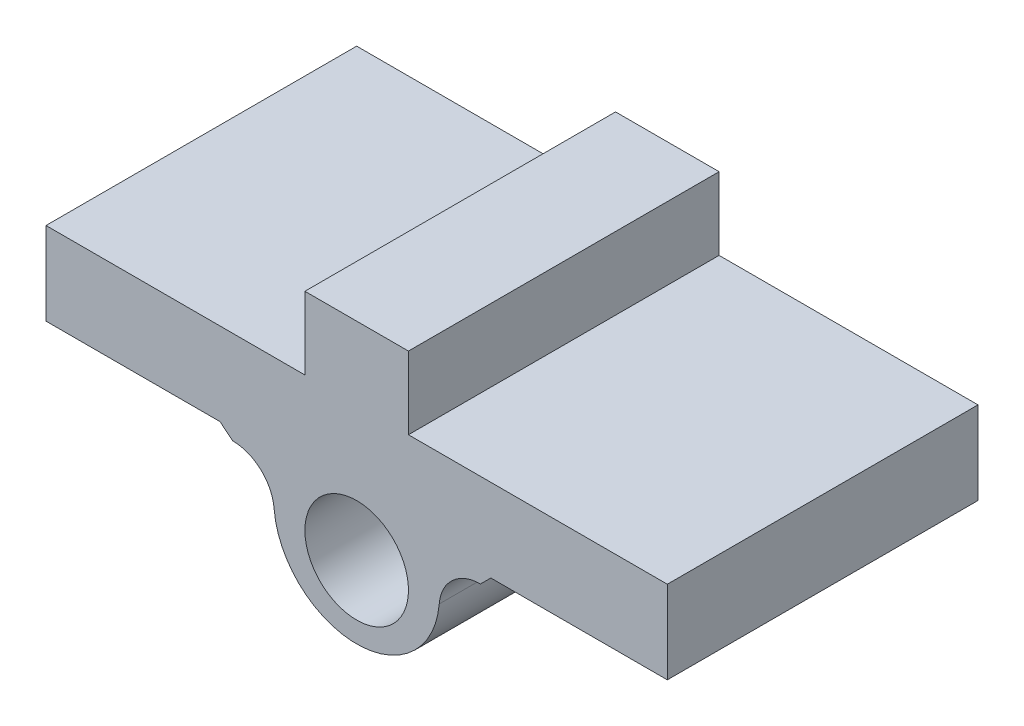
ISO-10303-21;
HEADER;
FILE_DESCRIPTION(('STEP AP214'),'2;1');
FILE_NAME('part.step','',(''),(''),'','','');
FILE_SCHEMA(('AUTOMOTIVE_DESIGN { 1 0 10303 214 1 1 1 1 }'));
ENDSEC;
DATA;
#1=APPLICATION_CONTEXT('core data for automotive mechanical design processes');
#2=APPLICATION_PROTOCOL_DEFINITION('international standard','automotive_design',2000,#1);
#3=PRODUCT_CONTEXT('',#1,'mechanical');
#4=PRODUCT('Part','Part','',(#3));
#5=PRODUCT_RELATED_PRODUCT_CATEGORY('part','',(#4));
#6=PRODUCT_DEFINITION_FORMATION('','',#4);
#7=PRODUCT_DEFINITION_CONTEXT('part definition',#1,'design');
#8=PRODUCT_DEFINITION('design','',#6,#7);
#9=PRODUCT_DEFINITION_SHAPE('','',#8);
#10=(LENGTH_UNIT() NAMED_UNIT(*) SI_UNIT(.MILLI.,.METRE.));
#11=(NAMED_UNIT(*) PLANE_ANGLE_UNIT() SI_UNIT($,.RADIAN.));
#12=(NAMED_UNIT(*) SI_UNIT($,.STERADIAN.) SOLID_ANGLE_UNIT());
#13=UNCERTAINTY_MEASURE_WITH_UNIT(LENGTH_MEASURE(1.E-05),#10,'distance_accuracy_value','');
#14=(GEOMETRIC_REPRESENTATION_CONTEXT(3) GLOBAL_UNCERTAINTY_ASSIGNED_CONTEXT((#13)) GLOBAL_UNIT_ASSIGNED_CONTEXT((#10,
#11,#12)) REPRESENTATION_CONTEXT('',''));
#15=CARTESIAN_POINT('',(0.,0.,0.));
#16=DIRECTION('',(0.,0.,1.));
#17=DIRECTION('',(1.,0.,0.));
#18=AXIS2_PLACEMENT_3D('',#15,#16,#17);
#19=CARTESIAN_POINT('',(0.,0.,0.));
#20=DIRECTION('',(0.,-1.,0.));
#21=DIRECTION('',(0.,0.,-1.));
#22=AXIS2_PLACEMENT_3D('',#19,#20,#21);
#23=PLANE('',#22);
#24=DIRECTION('',(0.,0.,-1.));
#25=VECTOR('',#24,1.);
#26=CARTESIAN_POINT('',(16.8030447960703,0.,28.7766454131789));
#27=LINE('',#26,#25);
#28=CARTESIAN_POINT('',(16.8030447960703,0.,0.));
#29=VERTEX_POINT('',#28);
#30=CARTESIAN_POINT('',(16.8030447960703,0.,-30.));
#31=VERTEX_POINT('',#30);
#32=EDGE_CURVE('E236',#29,#31,#27,.T.);
#33=ORIENTED_EDGE('',*,*,#32,.F.);
#34=DIRECTION('',(1.,0.,0.));
#35=VECTOR('',#34,1.);
#36=CARTESIAN_POINT('',(0.,0.,0.));
#37=LINE('',#36,#35);
#38=CARTESIAN_POINT('',(0.,0.,0.));
#39=VERTEX_POINT('',#38);
#40=EDGE_CURVE('E188',#39,#29,#37,.T.);
#41=ORIENTED_EDGE('',*,*,#40,.F.);
#42=DIRECTION('',(0.,0.,1.));
#43=VECTOR('',#42,1.);
#44=CARTESIAN_POINT('',(0.,0.,0.));
#45=LINE('',#44,#43);
#46=CARTESIAN_POINT('',(0.,0.,-30.));
#47=VERTEX_POINT('',#46);
#48=EDGE_CURVE('E190',#47,#39,#45,.T.);
#49=ORIENTED_EDGE('',*,*,#48,.F.);
#50=DIRECTION('',(-1.,0.,0.));
#51=VECTOR('',#50,1.);
#52=CARTESIAN_POINT('',(0.,0.,-30.));
#53=LINE('',#52,#51);
#54=EDGE_CURVE('E168',#31,#47,#53,.T.);
#55=ORIENTED_EDGE('',*,*,#54,.F.);
#56=EDGE_LOOP('',(#33,#41,#49,#55));
#57=FACE_BOUND('',#56,.T.);
#58=ADVANCED_FACE('F37',(#57),#23,.T.);
#59=CARTESIAN_POINT('',(0.,8.,0.));
#60=DIRECTION('',(0.,-1.,0.));
#61=DIRECTION('',(0.,0.,-1.));
#62=AXIS2_PLACEMENT_3D('',#59,#60,#61);
#63=PLANE('',#62);
#64=DIRECTION('',(0.,0.,1.));
#65=VECTOR('',#64,1.);
#66=CARTESIAN_POINT('',(25.,8.,-30.));
#67=LINE('',#66,#65);
#68=CARTESIAN_POINT('',(25.,8.,-30.));
#69=VERTEX_POINT('',#68);
#70=CARTESIAN_POINT('',(25.,8.,0.));
#71=VERTEX_POINT('',#70);
#72=EDGE_CURVE('E52',#69,#71,#67,.T.);
#73=ORIENTED_EDGE('',*,*,#72,.F.);
#74=DIRECTION('',(-1.,0.,0.));
#75=VECTOR('',#74,1.);
#76=CARTESIAN_POINT('',(0.,8.,-30.));
#77=LINE('',#76,#75);
#78=CARTESIAN_POINT('',(0.,8.,-30.));
#79=VERTEX_POINT('',#78);
#80=EDGE_CURVE('E196',#69,#79,#77,.T.);
#81=ORIENTED_EDGE('',*,*,#80,.T.);
#82=DIRECTION('',(0.,0.,1.));
#83=VECTOR('',#82,1.);
#84=CARTESIAN_POINT('',(0.,8.,0.));
#85=LINE('',#84,#83);
#86=CARTESIAN_POINT('',(0.,8.,0.));
#87=VERTEX_POINT('',#86);
#88=EDGE_CURVE('E167',#79,#87,#85,.T.);
#89=ORIENTED_EDGE('',*,*,#88,.T.);
#90=DIRECTION('',(1.,0.,0.));
#91=VECTOR('',#90,1.);
#92=CARTESIAN_POINT('',(0.,8.,0.));
#93=LINE('',#92,#91);
#94=EDGE_CURVE('E198',#87,#71,#93,.T.);
#95=ORIENTED_EDGE('',*,*,#94,.T.);
#96=EDGE_LOOP('',(#73,#81,#89,#95));
#97=FACE_BOUND('',#96,.T.);
#98=ADVANCED_FACE('F296',(#97),#63,.F.);
#99=DIRECTION('',(0.,0.,-1.));
#100=VECTOR('',#99,1.);
#101=CARTESIAN_POINT('',(35.,8.,-30.));
#102=LINE('',#101,#100);
#103=CARTESIAN_POINT('',(35.,8.,0.));
#104=VERTEX_POINT('',#103);
#105=CARTESIAN_POINT('',(35.,8.,-30.));
#106=VERTEX_POINT('',#105);
#107=EDGE_CURVE('E60',#104,#106,#102,.T.);
#108=ORIENTED_EDGE('',*,*,#107,.F.);
#109=CARTESIAN_POINT('',(60.,8.,0.));
#110=VERTEX_POINT('',#109);
#111=EDGE_CURVE('E171',#104,#110,#93,.T.);
#112=ORIENTED_EDGE('',*,*,#111,.T.);
#113=DIRECTION('',(0.,0.,-1.));
#114=VECTOR('',#113,1.);
#115=CARTESIAN_POINT('',(60.,8.,0.));
#116=LINE('',#115,#114);
#117=CARTESIAN_POINT('',(60.,8.,-30.));
#118=VERTEX_POINT('',#117);
#119=EDGE_CURVE('E186',#110,#118,#116,.T.);
#120=ORIENTED_EDGE('',*,*,#119,.T.);
#121=EDGE_CURVE('E180',#118,#106,#77,.T.);
#122=ORIENTED_EDGE('',*,*,#121,.T.);
#123=EDGE_LOOP('',(#108,#112,#120,#122));
#124=FACE_BOUND('',#123,.T.);
#125=ADVANCED_FACE('F294',(#124),#63,.F.);
#126=CARTESIAN_POINT('',(0.,8.,0.));
#127=DIRECTION('',(1.,0.,0.));
#128=DIRECTION('',(0.,0.,-1.));
#129=AXIS2_PLACEMENT_3D('',#126,#127,#128);
#130=PLANE('',#129);
#131=ORIENTED_EDGE('',*,*,#48,.T.);
#132=DIRECTION('',(0.,-1.,0.));
#133=VECTOR('',#132,1.);
#134=CARTESIAN_POINT('',(0.,8.,0.));
#135=LINE('',#134,#133);
#136=EDGE_CURVE('E11',#87,#39,#135,.T.);
#137=ORIENTED_EDGE('',*,*,#136,.F.);
#138=ORIENTED_EDGE('',*,*,#88,.F.);
#139=DIRECTION('',(0.,-1.,0.));
#140=VECTOR('',#139,1.);
#141=CARTESIAN_POINT('',(0.,8.,-30.));
#142=LINE('',#141,#140);
#143=EDGE_CURVE('E177',#79,#47,#142,.T.);
#144=ORIENTED_EDGE('',*,*,#143,.T.);
#145=EDGE_LOOP('',(#131,#137,#138,#144));
#146=FACE_BOUND('',#145,.T.);
#147=ADVANCED_FACE('F39',(#146),#130,.F.);
#148=CARTESIAN_POINT('',(0.,8.,0.));
#149=DIRECTION('',(0.,0.,-1.));
#150=DIRECTION('',(-1.,0.,0.));
#151=AXIS2_PLACEMENT_3D('',#148,#149,#150);
#152=PLANE('',#151);
#153=ORIENTED_EDGE('',*,*,#40,.T.);
#154=DIRECTION('',(0.778089765424907,-0.628153099921519,0.));
#155=VECTOR('',#154,1.);
#156=CARTESIAN_POINT('',(18.0417392568986,-1.,0.));
#157=LINE('',#156,#155);
#158=CARTESIAN_POINT('',(18.0417392568986,-1.,0.));
#159=VERTEX_POINT('',#158);
#160=EDGE_CURVE('E226',#29,#159,#157,.T.);
#161=ORIENTED_EDGE('',*,*,#160,.T.);
#162=CARTESIAN_POINT('',(18.0417392568986,-5.,0.));
#163=DIRECTION('',(0.,0.,-1.));
#164=DIRECTION('',(-1.,0.,0.));
#165=AXIS2_PLACEMENT_3D('',#162,#163,#164);
#166=CIRCLE('',#165,4.);
#167=CARTESIAN_POINT('',(22.0278261712657,-4.66666666666667,0.));
#168=VERTEX_POINT('',#167);
#169=EDGE_CURVE('E248',#159,#168,#166,.T.);
#170=ORIENTED_EDGE('',*,*,#169,.T.);
#171=CARTESIAN_POINT('',(30.,-4.,0.));
#172=DIRECTION('',(0.,0.,-1.));
#173=DIRECTION('',(-1.,0.,0.));
#174=AXIS2_PLACEMENT_3D('',#171,#172,#173);
#175=CIRCLE('',#174,8.);
#176=CARTESIAN_POINT('',(37.9721738287343,-4.66666666666666,0.));
#177=VERTEX_POINT('',#176);
#178=EDGE_CURVE('E250',#168,#177,#175,.F.);
#179=ORIENTED_EDGE('',*,*,#178,.T.);
#180=CARTESIAN_POINT('',(41.9582607431014,-5.,0.));
#181=DIRECTION('',(0.,0.,-1.));
#182=DIRECTION('',(-1.,0.,0.));
#183=AXIS2_PLACEMENT_3D('',#180,#181,#182);
#184=CIRCLE('',#183,4.);
#185=CARTESIAN_POINT('',(41.9582607431014,-1.,0.));
#186=VERTEX_POINT('',#185);
#187=EDGE_CURVE('E252',#177,#186,#184,.T.);
#188=ORIENTED_EDGE('',*,*,#187,.T.);
#189=DIRECTION('',(0.70710678118655,0.707106781186545,0.));
#190=VECTOR('',#189,1.);
#191=CARTESIAN_POINT('',(41.9582607431014,-1.,0.));
#192=LINE('',#191,#190);
#193=CARTESIAN_POINT('',(42.9582607431014,0.,0.));
#194=VERTEX_POINT('',#193);
#195=EDGE_CURVE('E238',#186,#194,#192,.T.);
#196=ORIENTED_EDGE('',*,*,#195,.T.);
#197=CARTESIAN_POINT('',(60.,0.,0.));
#198=VERTEX_POINT('',#197);
#199=EDGE_CURVE('E157',#194,#198,#37,.T.);
#200=ORIENTED_EDGE('',*,*,#199,.T.);
#201=DIRECTION('',(0.,-1.,0.));
#202=VECTOR('',#201,1.);
#203=CARTESIAN_POINT('',(60.,8.,0.));
#204=LINE('',#203,#202);
#205=EDGE_CURVE('E45',#110,#198,#204,.T.);
#206=ORIENTED_EDGE('',*,*,#205,.F.);
#207=ORIENTED_EDGE('',*,*,#111,.F.);
#208=DIRECTION('',(0.,-1.,0.));
#209=VECTOR('',#208,1.);
#210=CARTESIAN_POINT('',(35.,15.,0.));
#211=LINE('',#210,#209);
#212=CARTESIAN_POINT('',(35.,15.,0.));
#213=VERTEX_POINT('',#212);
#214=EDGE_CURVE('E202',#213,#104,#211,.T.);
#215=ORIENTED_EDGE('',*,*,#214,.F.);
#216=DIRECTION('',(1.,0.,0.));
#217=VECTOR('',#216,1.);
#218=CARTESIAN_POINT('',(25.,15.,0.));
#219=LINE('',#218,#217);
#220=CARTESIAN_POINT('',(25.,15.,0.));
#221=VERTEX_POINT('',#220);
#222=EDGE_CURVE('E219',#221,#213,#219,.T.);
#223=ORIENTED_EDGE('',*,*,#222,.F.);
#224=DIRECTION('',(0.,-1.,0.));
#225=VECTOR('',#224,1.);
#226=CARTESIAN_POINT('',(25.,15.,0.));
#227=LINE('',#226,#225);
#228=EDGE_CURVE('E194',#221,#71,#227,.T.);
#229=ORIENTED_EDGE('',*,*,#228,.T.);
#230=ORIENTED_EDGE('',*,*,#94,.F.);
#231=ORIENTED_EDGE('',*,*,#136,.T.);
#232=EDGE_LOOP('',(#153,#161,#170,#179,#188,#196,#200,#206,#207,#215,#223,#229,#230,#231));
#233=FACE_BOUND('',#232,.T.);
#234=CARTESIAN_POINT('',(30.,-5.,0.));
#235=DIRECTION('',(0.,0.,-1.));
#236=DIRECTION('',(-1.,0.,0.));
#237=AXIS2_PLACEMENT_3D('',#234,#235,#236);
#238=CIRCLE('',#237,5.);
#239=CARTESIAN_POINT('',(25.,-5.,0.));
#240=VERTEX_POINT('',#239);
#241=EDGE_CURVE('E215',#240,#240,#238,.T.);
#242=ORIENTED_EDGE('',*,*,#241,.T.);
#243=EDGE_LOOP('',(#242));
#244=FACE_BOUND('',#243,.T.);
#245=ADVANCED_FACE('F254',(#233,#244),#152,.F.);
#246=CARTESIAN_POINT('',(60.,8.,0.));
#247=DIRECTION('',(-1.,0.,0.));
#248=DIRECTION('',(0.,0.,1.));
#249=AXIS2_PLACEMENT_3D('',#246,#247,#248);
#250=PLANE('',#249);
#251=DIRECTION('',(0.,0.,-1.));
#252=VECTOR('',#251,1.);
#253=CARTESIAN_POINT('',(60.,0.,0.));
#254=LINE('',#253,#252);
#255=CARTESIAN_POINT('',(60.,0.,-30.));
#256=VERTEX_POINT('',#255);
#257=EDGE_CURVE('E173',#198,#256,#254,.T.);
#258=ORIENTED_EDGE('',*,*,#257,.T.);
#259=DIRECTION('',(0.,-1.,0.));
#260=VECTOR('',#259,1.);
#261=CARTESIAN_POINT('',(60.,8.,-30.));
#262=LINE('',#261,#260);
#263=EDGE_CURVE('E166',#118,#256,#262,.T.);
#264=ORIENTED_EDGE('',*,*,#263,.F.);
#265=ORIENTED_EDGE('',*,*,#119,.F.);
#266=ORIENTED_EDGE('',*,*,#205,.T.);
#267=EDGE_LOOP('',(#258,#264,#265,#266));
#268=FACE_BOUND('',#267,.T.);
#269=ADVANCED_FACE('F185',(#268),#250,.F.);
#270=CARTESIAN_POINT('',(0.,8.,-30.));
#271=DIRECTION('',(0.,0.,1.));
#272=DIRECTION('',(1.,0.,0.));
#273=AXIS2_PLACEMENT_3D('',#270,#271,#272);
#274=PLANE('',#273);
#275=DIRECTION('',(-0.778089765424907,0.628153099921519,0.));
#276=VECTOR('',#275,1.);
#277=CARTESIAN_POINT('',(18.0417392568986,-1.,-30.));
#278=LINE('',#277,#276);
#279=CARTESIAN_POINT('',(18.0417392568986,-1.,-30.));
#280=VERTEX_POINT('',#279);
#281=EDGE_CURVE('E158',#280,#31,#278,.T.);
#282=ORIENTED_EDGE('',*,*,#281,.T.);
#283=ORIENTED_EDGE('',*,*,#54,.T.);
#284=ORIENTED_EDGE('',*,*,#143,.F.);
#285=ORIENTED_EDGE('',*,*,#80,.F.);
#286=DIRECTION('',(0.,-1.,0.));
#287=VECTOR('',#286,1.);
#288=CARTESIAN_POINT('',(25.,15.,-30.));
#289=LINE('',#288,#287);
#290=CARTESIAN_POINT('',(25.,15.,-30.));
#291=VERTEX_POINT('',#290);
#292=EDGE_CURVE('E208',#291,#69,#289,.T.);
#293=ORIENTED_EDGE('',*,*,#292,.F.);
#294=DIRECTION('',(-1.,0.,0.));
#295=VECTOR('',#294,1.);
#296=CARTESIAN_POINT('',(25.,15.,-30.));
#297=LINE('',#296,#295);
#298=CARTESIAN_POINT('',(35.,15.,-30.));
#299=VERTEX_POINT('',#298);
#300=EDGE_CURVE('E211',#299,#291,#297,.T.);
#301=ORIENTED_EDGE('',*,*,#300,.F.);
#302=DIRECTION('',(0.,-1.,0.));
#303=VECTOR('',#302,1.);
#304=CARTESIAN_POINT('',(35.,15.,-30.));
#305=LINE('',#304,#303);
#306=EDGE_CURVE('E205',#299,#106,#305,.T.);
#307=ORIENTED_EDGE('',*,*,#306,.T.);
#308=ORIENTED_EDGE('',*,*,#121,.F.);
#309=ORIENTED_EDGE('',*,*,#263,.T.);
#310=CARTESIAN_POINT('',(42.9582607431014,0.,-30.));
#311=VERTEX_POINT('',#310);
#312=EDGE_CURVE('E156',#256,#311,#53,.T.);
#313=ORIENTED_EDGE('',*,*,#312,.T.);
#314=DIRECTION('',(-0.70710678118655,-0.707106781186545,0.));
#315=VECTOR('',#314,1.);
#316=CARTESIAN_POINT('',(41.9582607431014,-1.,-30.));
#317=LINE('',#316,#315);
#318=CARTESIAN_POINT('',(41.9582607431014,-1.,-30.));
#319=VERTEX_POINT('',#318);
#320=EDGE_CURVE('E138',#311,#319,#317,.T.);
#321=ORIENTED_EDGE('',*,*,#320,.T.);
#322=CARTESIAN_POINT('',(41.9582607431014,-5.,-30.));
#323=DIRECTION('',(0.,0.,1.));
#324=DIRECTION('',(-1.,0.,0.));
#325=AXIS2_PLACEMENT_3D('',#322,#323,#324);
#326=CIRCLE('',#325,4.);
#327=CARTESIAN_POINT('',(37.9721738287343,-4.66666666666666,-30.));
#328=VERTEX_POINT('',#327);
#329=EDGE_CURVE('E150',#319,#328,#326,.T.);
#330=ORIENTED_EDGE('',*,*,#329,.T.);
#331=CARTESIAN_POINT('',(30.,-4.,-30.));
#332=DIRECTION('',(0.,0.,-1.));
#333=DIRECTION('',(-1.,0.,0.));
#334=AXIS2_PLACEMENT_3D('',#331,#332,#333);
#335=CIRCLE('',#334,8.);
#336=CARTESIAN_POINT('',(22.0278261712657,-4.66666666666667,-30.));
#337=VERTEX_POINT('',#336);
#338=EDGE_CURVE('E243',#328,#337,#335,.T.);
#339=ORIENTED_EDGE('',*,*,#338,.T.);
#340=CARTESIAN_POINT('',(18.0417392568986,-5.,-30.));
#341=DIRECTION('',(0.,0.,1.));
#342=DIRECTION('',(-1.,0.,0.));
#343=AXIS2_PLACEMENT_3D('',#340,#341,#342);
#344=CIRCLE('',#343,4.);
#345=EDGE_CURVE('E240',#337,#280,#344,.T.);
#346=ORIENTED_EDGE('',*,*,#345,.T.);
#347=EDGE_LOOP('',(#282,#283,#284,#285,#293,#301,#307,#308,#309,#313,#321,#330,#339,#346));
#348=FACE_BOUND('',#347,.T.);
#349=CARTESIAN_POINT('',(30.,-5.,-30.));
#350=DIRECTION('',(0.,0.,-1.));
#351=DIRECTION('',(-1.,0.,0.));
#352=AXIS2_PLACEMENT_3D('',#349,#350,#351);
#353=CIRCLE('',#352,5.);
#354=CARTESIAN_POINT('',(25.,-5.,-30.));
#355=VERTEX_POINT('',#354);
#356=EDGE_CURVE('E223',#355,#355,#353,.T.);
#357=ORIENTED_EDGE('',*,*,#356,.F.);
#358=EDGE_LOOP('',(#357));
#359=FACE_BOUND('',#358,.T.);
#360=ADVANCED_FACE('F162',(#348,#359),#274,.F.);
#361=DIRECTION('',(0.,0.,-1.));
#362=VECTOR('',#361,1.);
#363=CARTESIAN_POINT('',(42.9582607431014,0.,28.7766454131789));
#364=LINE('',#363,#362);
#365=EDGE_CURVE('E142',#194,#311,#364,.T.);
#366=ORIENTED_EDGE('',*,*,#365,.T.);
#367=ORIENTED_EDGE('',*,*,#312,.F.);
#368=ORIENTED_EDGE('',*,*,#257,.F.);
#369=ORIENTED_EDGE('',*,*,#199,.F.);
#370=EDGE_LOOP('',(#366,#367,#368,#369));
#371=FACE_BOUND('',#370,.T.);
#372=ADVANCED_FACE('F154',(#371),#23,.T.);
#373=CARTESIAN_POINT('',(25.,15.,-30.));
#374=DIRECTION('',(1.,0.,0.));
#375=DIRECTION('',(0.,0.,-1.));
#376=AXIS2_PLACEMENT_3D('',#373,#374,#375);
#377=PLANE('',#376);
#378=ORIENTED_EDGE('',*,*,#72,.T.);
#379=ORIENTED_EDGE('',*,*,#228,.F.);
#380=DIRECTION('',(0.,0.,1.));
#381=VECTOR('',#380,1.);
#382=CARTESIAN_POINT('',(25.,15.,-30.));
#383=LINE('',#382,#381);
#384=EDGE_CURVE('E213',#291,#221,#383,.T.);
#385=ORIENTED_EDGE('',*,*,#384,.F.);
#386=ORIENTED_EDGE('',*,*,#292,.T.);
#387=EDGE_LOOP('',(#378,#379,#385,#386));
#388=FACE_BOUND('',#387,.T.);
#389=ADVANCED_FACE('F285',(#388),#377,.F.);
#390=CARTESIAN_POINT('',(35.,15.,-30.));
#391=DIRECTION('',(-1.,0.,0.));
#392=DIRECTION('',(0.,0.,1.));
#393=AXIS2_PLACEMENT_3D('',#390,#391,#392);
#394=PLANE('',#393);
#395=ORIENTED_EDGE('',*,*,#107,.T.);
#396=ORIENTED_EDGE('',*,*,#306,.F.);
#397=DIRECTION('',(0.,0.,-1.));
#398=VECTOR('',#397,1.);
#399=CARTESIAN_POINT('',(35.,15.,-30.));
#400=LINE('',#399,#398);
#401=EDGE_CURVE('E217',#213,#299,#400,.T.);
#402=ORIENTED_EDGE('',*,*,#401,.F.);
#403=ORIENTED_EDGE('',*,*,#214,.T.);
#404=EDGE_LOOP('',(#395,#396,#402,#403));
#405=FACE_BOUND('',#404,.T.);
#406=ADVANCED_FACE('F293',(#405),#394,.F.);
#407=CARTESIAN_POINT('',(0.,15.,0.));
#408=DIRECTION('',(0.,1.,0.));
#409=DIRECTION('',(0.,0.,1.));
#410=AXIS2_PLACEMENT_3D('',#407,#408,#409);
#411=PLANE('',#410);
#412=ORIENTED_EDGE('',*,*,#384,.T.);
#413=ORIENTED_EDGE('',*,*,#222,.T.);
#414=ORIENTED_EDGE('',*,*,#401,.T.);
#415=ORIENTED_EDGE('',*,*,#300,.T.);
#416=EDGE_LOOP('',(#412,#413,#414,#415));
#417=FACE_BOUND('',#416,.T.);
#418=ADVANCED_FACE('F288',(#417),#411,.T.);
#419=CARTESIAN_POINT('',(30.,-5.,0.));
#420=DIRECTION('',(0.,0.,-1.));
#421=DIRECTION('',(-1.,0.,0.));
#422=AXIS2_PLACEMENT_3D('',#419,#420,#421);
#423=CYLINDRICAL_SURFACE('',#422,5.);
#424=CARTESIAN_POINT('',(25.,-5.,0.));
#425=CARTESIAN_POINT('',(25.,-5.,-0.3125));
#426=CARTESIAN_POINT('',(25.,-5.,-0.625));
#427=CARTESIAN_POINT('',(25.,-5.,-1.25));
#428=CARTESIAN_POINT('',(25.,-5.,-1.5625));
#429=CARTESIAN_POINT('',(25.,-5.,-2.1875));
#430=CARTESIAN_POINT('',(25.,-5.,-2.5));
#431=CARTESIAN_POINT('',(25.,-5.,-3.125));
#432=CARTESIAN_POINT('',(25.,-5.,-3.4375));
#433=CARTESIAN_POINT('',(25.,-5.,-4.0625));
#434=CARTESIAN_POINT('',(25.,-5.,-4.375));
#435=CARTESIAN_POINT('',(25.,-5.,-5.));
#436=CARTESIAN_POINT('',(25.,-5.,-5.3125));
#437=CARTESIAN_POINT('',(25.,-5.,-5.9375));
#438=CARTESIAN_POINT('',(25.,-5.,-6.25));
#439=CARTESIAN_POINT('',(25.,-5.,-6.875));
#440=CARTESIAN_POINT('',(25.,-5.,-7.1875));
#441=CARTESIAN_POINT('',(25.,-5.,-7.8125));
#442=CARTESIAN_POINT('',(25.,-5.,-8.125));
#443=CARTESIAN_POINT('',(25.,-5.,-8.75));
#444=CARTESIAN_POINT('',(25.,-5.,-9.0625));
#445=CARTESIAN_POINT('',(25.,-5.,-9.6875));
#446=CARTESIAN_POINT('',(25.,-5.,-10.));
#447=CARTESIAN_POINT('',(25.,-5.,-10.625));
#448=CARTESIAN_POINT('',(25.,-5.,-10.9375));
#449=CARTESIAN_POINT('',(25.,-5.,-11.5625));
#450=CARTESIAN_POINT('',(25.,-5.,-11.875));
#451=CARTESIAN_POINT('',(25.,-5.,-12.5));
#452=CARTESIAN_POINT('',(25.,-5.,-12.8125));
#453=CARTESIAN_POINT('',(25.,-5.,-13.4375));
#454=CARTESIAN_POINT('',(25.,-5.,-13.75));
#455=CARTESIAN_POINT('',(25.,-5.,-14.375));
#456=CARTESIAN_POINT('',(25.,-5.,-14.6875));
#457=CARTESIAN_POINT('',(25.,-5.,-15.3125));
#458=CARTESIAN_POINT('',(25.,-5.,-15.625));
#459=CARTESIAN_POINT('',(25.,-5.,-16.25));
#460=CARTESIAN_POINT('',(25.,-5.,-16.5625));
#461=CARTESIAN_POINT('',(25.,-5.,-17.1875));
#462=CARTESIAN_POINT('',(25.,-5.,-17.5));
#463=CARTESIAN_POINT('',(25.,-5.,-18.125));
#464=CARTESIAN_POINT('',(25.,-5.,-18.4375));
#465=CARTESIAN_POINT('',(25.,-5.,-19.0625));
#466=CARTESIAN_POINT('',(25.,-5.,-19.375));
#467=CARTESIAN_POINT('',(25.,-5.,-20.));
#468=CARTESIAN_POINT('',(25.,-5.,-20.3125));
#469=CARTESIAN_POINT('',(25.,-5.,-20.9375));
#470=CARTESIAN_POINT('',(25.,-5.,-21.25));
#471=CARTESIAN_POINT('',(25.,-5.,-21.875));
#472=CARTESIAN_POINT('',(25.,-5.,-22.1875));
#473=CARTESIAN_POINT('',(25.,-5.,-22.8125));
#474=CARTESIAN_POINT('',(25.,-5.,-23.125));
#475=CARTESIAN_POINT('',(25.,-5.,-23.75));
#476=CARTESIAN_POINT('',(25.,-5.,-24.0625));
#477=CARTESIAN_POINT('',(25.,-5.,-24.6875));
#478=CARTESIAN_POINT('',(25.,-5.,-25.));
#479=CARTESIAN_POINT('',(25.,-5.,-25.625));
#480=CARTESIAN_POINT('',(25.,-5.,-25.9375));
#481=CARTESIAN_POINT('',(25.,-5.,-26.5625));
#482=CARTESIAN_POINT('',(25.,-5.,-26.875));
#483=CARTESIAN_POINT('',(25.,-5.,-27.5));
#484=CARTESIAN_POINT('',(25.,-5.,-27.8125));
#485=CARTESIAN_POINT('',(25.,-5.,-28.4375));
#486=CARTESIAN_POINT('',(25.,-5.,-28.75));
#487=CARTESIAN_POINT('',(25.,-5.,-29.375));
#488=CARTESIAN_POINT('',(25.,-5.,-29.6875));
#489=CARTESIAN_POINT('',(25.,-5.,-30.));
#490=B_SPLINE_CURVE_WITH_KNOTS('',3,(#424,#425,#426,#427,#428,#429,#430,#431,#432,#433,#434,
#435,#436,#437,#438,#439,#440,#441,#442,#443,#444,#445,#446,#447,#448,#449,#450,#451,#452,#453,
#454,#455,#456,#457,#458,#459,#460,#461,#462,#463,#464,#465,#466,#467,#468,#469,#470,#471,#472,
#473,#474,#475,#476,#477,#478,#479,#480,#481,#482,#483,#484,#485,#486,#487,#488,#489),
.UNSPECIFIED.,.F.,.F.,(4,2,2,2,2,2,2,2,2,2,2,2,2,2,2,2,2,2,2,2,2,2,2,2,2,2,2,2,2,2,2,2,4),(0.,
0.9375,1.875,2.8125,3.75,4.6875,5.625,6.5625,7.5,8.4375,9.375,10.3125,11.25,12.1875,13.125,
14.0625,15.,15.9375,16.875,17.8125,18.75,19.6875,20.625,21.5625,22.5,23.4375,24.375,25.3125,
26.25,27.1875,28.125,29.0625,30.),.UNSPECIFIED.);
#491=EDGE_CURVE('BSEAM368',#240,#355,#490,.T.);
#492=ORIENTED_EDGE('',*,*,#241,.F.);
#493=ORIENTED_EDGE('',*,*,#356,.T.);
#494=ORIENTED_EDGE('',*,*,#491,.T.);
#495=ORIENTED_EDGE('',*,*,#491,.F.);
#496=EDGE_LOOP('',(#492,#494,#493,#495));
#497=FACE_BOUND('',#496,.T.);
#498=ADVANCED_FACE('F368',(#497),#423,.F.);
#499=CARTESIAN_POINT('',(18.0417392568986,-1.,28.7766454131789));
#500=DIRECTION('',(-0.628153099921519,-0.778089765424907,0.));
#501=DIRECTION('',(0.778089765424907,-0.628153099921519,0.));
#502=AXIS2_PLACEMENT_3D('',#499,#500,#501);
#503=PLANE('',#502);
#504=ORIENTED_EDGE('',*,*,#160,.F.);
#505=ORIENTED_EDGE('',*,*,#32,.T.);
#506=ORIENTED_EDGE('',*,*,#281,.F.);
#507=DIRECTION('',(0.,0.,-1.));
#508=VECTOR('',#507,1.);
#509=CARTESIAN_POINT('',(18.0417392568986,-1.,28.7766454131789));
#510=LINE('',#509,#508);
#511=EDGE_CURVE('E234',#159,#280,#510,.T.);
#512=ORIENTED_EDGE('',*,*,#511,.F.);
#513=EDGE_LOOP('',(#504,#505,#506,#512));
#514=FACE_BOUND('',#513,.T.);
#515=ADVANCED_FACE('F272',(#514),#503,.T.);
#516=CARTESIAN_POINT('',(18.0417392568986,-5.,28.7766454131789));
#517=DIRECTION('',(0.,0.,-1.));
#518=DIRECTION('',(-1.,0.,0.));
#519=AXIS2_PLACEMENT_3D('',#516,#517,#518);
#520=CYLINDRICAL_SURFACE('',#519,4.);
#521=ORIENTED_EDGE('',*,*,#169,.F.);
#522=ORIENTED_EDGE('',*,*,#511,.T.);
#523=ORIENTED_EDGE('',*,*,#345,.F.);
#524=DIRECTION('',(0.,0.,-1.));
#525=VECTOR('',#524,1.);
#526=CARTESIAN_POINT('',(22.0278261712657,-4.66666666666667,28.7766454131789));
#527=LINE('',#526,#525);
#528=EDGE_CURVE('E232',#168,#337,#527,.T.);
#529=ORIENTED_EDGE('',*,*,#528,.F.);
#530=EDGE_LOOP('',(#521,#522,#523,#529));
#531=FACE_BOUND('',#530,.T.);
#532=ADVANCED_FACE('F268',(#531),#520,.F.);
#533=CARTESIAN_POINT('',(30.,-4.,28.7766454131789));
#534=DIRECTION('',(0.,0.,-1.));
#535=DIRECTION('',(-1.,0.,0.));
#536=AXIS2_PLACEMENT_3D('',#533,#534,#535);
#537=CYLINDRICAL_SURFACE('',#536,8.);
#538=ORIENTED_EDGE('',*,*,#178,.F.);
#539=ORIENTED_EDGE('',*,*,#528,.T.);
#540=ORIENTED_EDGE('',*,*,#338,.F.);
#541=DIRECTION('',(0.,0.,-1.));
#542=VECTOR('',#541,1.);
#543=CARTESIAN_POINT('',(37.9721738287343,-4.66666666666666,28.7766454131789));
#544=LINE('',#543,#542);
#545=EDGE_CURVE('E230',#177,#328,#544,.T.);
#546=ORIENTED_EDGE('',*,*,#545,.F.);
#547=EDGE_LOOP('',(#538,#539,#540,#546));
#548=FACE_BOUND('',#547,.T.);
#549=ADVANCED_FACE('F264',(#548),#537,.T.);
#550=CARTESIAN_POINT('',(41.9582607431014,-5.,28.7766454131789));
#551=DIRECTION('',(0.,0.,-1.));
#552=DIRECTION('',(-1.,0.,0.));
#553=AXIS2_PLACEMENT_3D('',#550,#551,#552);
#554=CYLINDRICAL_SURFACE('',#553,4.);
#555=ORIENTED_EDGE('',*,*,#187,.F.);
#556=ORIENTED_EDGE('',*,*,#545,.T.);
#557=ORIENTED_EDGE('',*,*,#329,.F.);
#558=DIRECTION('',(0.,0.,-1.));
#559=VECTOR('',#558,1.);
#560=CARTESIAN_POINT('',(41.9582607431014,-1.,28.7766454131789));
#561=LINE('',#560,#559);
#562=EDGE_CURVE('E145',#186,#319,#561,.T.);
#563=ORIENTED_EDGE('',*,*,#562,.F.);
#564=EDGE_LOOP('',(#555,#556,#557,#563));
#565=FACE_BOUND('',#564,.T.);
#566=ADVANCED_FACE('F258',(#565),#554,.F.);
#567=CARTESIAN_POINT('',(41.9582607431014,-1.,28.7766454131789));
#568=DIRECTION('',(0.707106781186545,-0.70710678118655,0.));
#569=DIRECTION('',(0.70710678118655,0.707106781186545,0.));
#570=AXIS2_PLACEMENT_3D('',#567,#568,#569);
#571=PLANE('',#570);
#572=ORIENTED_EDGE('',*,*,#195,.F.);
#573=ORIENTED_EDGE('',*,*,#562,.T.);
#574=ORIENTED_EDGE('',*,*,#320,.F.);
#575=ORIENTED_EDGE('',*,*,#365,.F.);
#576=EDGE_LOOP('',(#572,#573,#574,#575));
#577=FACE_BOUND('',#576,.T.);
#578=ADVANCED_FACE('F141',(#577),#571,.T.);
#579=CLOSED_SHELL('',(#58,#98,#125,#147,#245,#269,#360,#372,#389,#406,#418,#498,#515,#532,#549,
#566,#578));
#580=MANIFOLD_SOLID_BREP('B2',#579);
#581=ADVANCED_BREP_SHAPE_REPRESENTATION('',(#18,#580),#14);
#582=SHAPE_DEFINITION_REPRESENTATION(#9,#581);
ENDSEC;
END-ISO-10303-21;
